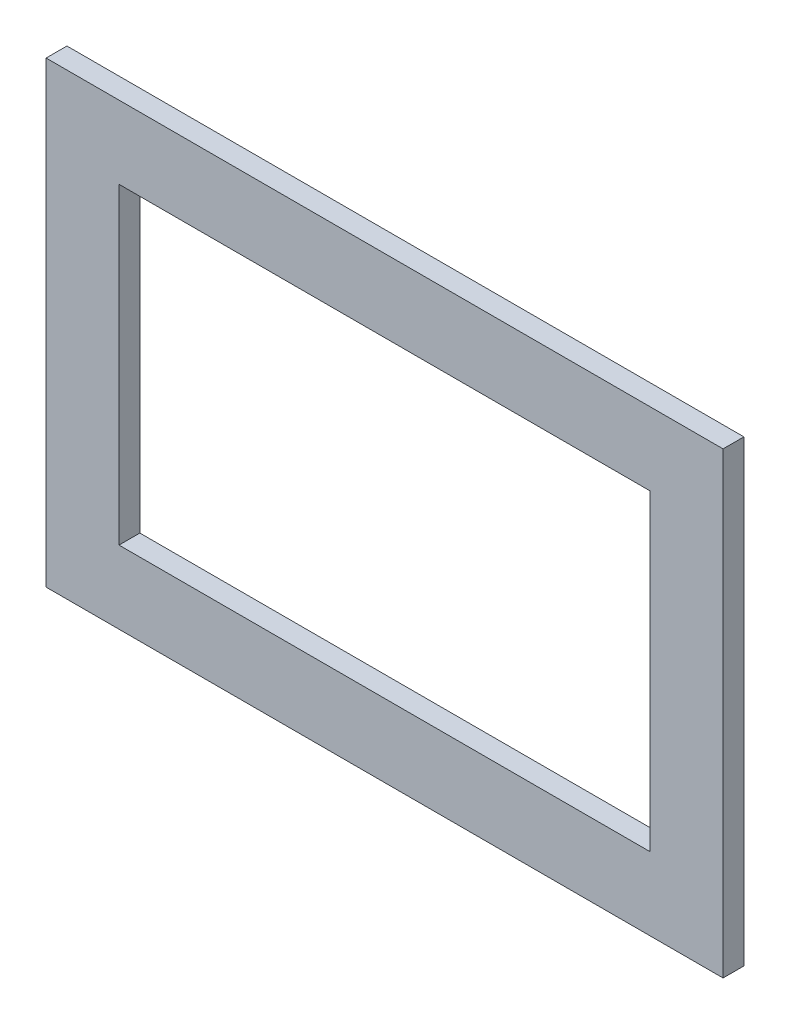
ISO-10303-21;
HEADER;
FILE_DESCRIPTION(('STEP AP214'),'2;1');
FILE_NAME('part.step','',(''),(''),'','','');
FILE_SCHEMA(('AUTOMOTIVE_DESIGN { 1 0 10303 214 1 1 1 1 }'));
ENDSEC;
DATA;
#1=APPLICATION_CONTEXT('core data for automotive mechanical design processes');
#2=APPLICATION_PROTOCOL_DEFINITION('international standard','automotive_design',2000,#1);
#3=PRODUCT_CONTEXT('',#1,'mechanical');
#4=PRODUCT('Part','Part','',(#3));
#5=PRODUCT_RELATED_PRODUCT_CATEGORY('part','',(#4));
#6=PRODUCT_DEFINITION_FORMATION('','',#4);
#7=PRODUCT_DEFINITION_CONTEXT('part definition',#1,'design');
#8=PRODUCT_DEFINITION('design','',#6,#7);
#9=PRODUCT_DEFINITION_SHAPE('','',#8);
#10=(LENGTH_UNIT() NAMED_UNIT(*) SI_UNIT(.MILLI.,.METRE.));
#11=(NAMED_UNIT(*) PLANE_ANGLE_UNIT() SI_UNIT($,.RADIAN.));
#12=(NAMED_UNIT(*) SI_UNIT($,.STERADIAN.) SOLID_ANGLE_UNIT());
#13=UNCERTAINTY_MEASURE_WITH_UNIT(LENGTH_MEASURE(1.E-05),#10,'distance_accuracy_value','');
#14=(GEOMETRIC_REPRESENTATION_CONTEXT(3) GLOBAL_UNCERTAINTY_ASSIGNED_CONTEXT((#13)) GLOBAL_UNIT_ASSIGNED_CONTEXT((#10,
#11,#12)) REPRESENTATION_CONTEXT('',''));
#15=CARTESIAN_POINT('',(0.,0.,0.));
#16=DIRECTION('',(0.,0.,1.));
#17=DIRECTION('',(1.,0.,0.));
#18=AXIS2_PLACEMENT_3D('',#15,#16,#17);
#19=CARTESIAN_POINT('',(0.,0.,20.));
#20=DIRECTION('',(0.,0.,1.));
#21=DIRECTION('',(1.,0.,0.));
#22=AXIS2_PLACEMENT_3D('',#19,#20,#21);
#23=PLANE('',#22);
#24=DIRECTION('',(0.,-1.,0.));
#25=VECTOR('',#24,1.);
#26=CARTESIAN_POINT('',(-266.698473282443,134.080195581127,20.));
#27=LINE('',#26,#25);
#28=CARTESIAN_POINT('',(-266.698473282443,134.080195581127,20.));
#29=VERTEX_POINT('',#28);
#30=CARTESIAN_POINT('',(-266.698473282443,-305.919804418873,20.));
#31=VERTEX_POINT('',#30);
#32=EDGE_CURVE('E153',#29,#31,#27,.T.);
#33=ORIENTED_EDGE('',*,*,#32,.T.);
#34=DIRECTION('',(1.,0.,0.));
#35=VECTOR('',#34,1.);
#36=CARTESIAN_POINT('',(-266.698473282443,-305.919804418873,20.));
#37=LINE('',#36,#35);
#38=CARTESIAN_POINT('',(383.301526717557,-305.919804418873,20.));
#39=VERTEX_POINT('',#38);
#40=EDGE_CURVE('E157',#31,#39,#37,.T.);
#41=ORIENTED_EDGE('',*,*,#40,.T.);
#42=DIRECTION('',(0.,1.,0.));
#43=VECTOR('',#42,1.);
#44=CARTESIAN_POINT('',(383.301526717557,134.080195581127,20.));
#45=LINE('',#44,#43);
#46=CARTESIAN_POINT('',(383.301526717557,134.080195581127,20.));
#47=VERTEX_POINT('',#46);
#48=EDGE_CURVE('E161',#39,#47,#45,.T.);
#49=ORIENTED_EDGE('',*,*,#48,.T.);
#50=DIRECTION('',(-1.,0.,0.));
#51=VECTOR('',#50,1.);
#52=CARTESIAN_POINT('',(-266.698473282443,134.080195581127,20.));
#53=LINE('',#52,#51);
#54=EDGE_CURVE('E164',#47,#29,#53,.T.);
#55=ORIENTED_EDGE('',*,*,#54,.T.);
#56=EDGE_LOOP('',(#33,#41,#49,#55));
#57=FACE_BOUND('',#56,.T.);
#58=DIRECTION('',(1.,0.,0.));
#59=VECTOR('',#58,1.);
#60=CARTESIAN_POINT('',(-196.698473282443,-235.919804418873,20.));
#61=LINE('',#60,#59);
#62=CARTESIAN_POINT('',(-196.698473282443,-235.919804418873,20.));
#63=VERTEX_POINT('',#62);
#64=CARTESIAN_POINT('',(313.301526717557,-235.919804418873,20.));
#65=VERTEX_POINT('',#64);
#66=EDGE_CURVE('E114',#63,#65,#61,.T.);
#67=ORIENTED_EDGE('',*,*,#66,.F.);
#68=DIRECTION('',(0.,-1.,0.));
#69=VECTOR('',#68,1.);
#70=CARTESIAN_POINT('',(-196.698473282443,64.0801955811267,20.));
#71=LINE('',#70,#69);
#72=CARTESIAN_POINT('',(-196.698473282443,64.0801955811267,20.));
#73=VERTEX_POINT('',#72);
#74=EDGE_CURVE('E105',#73,#63,#71,.T.);
#75=ORIENTED_EDGE('',*,*,#74,.F.);
#76=DIRECTION('',(-1.,0.,0.));
#77=VECTOR('',#76,1.);
#78=CARTESIAN_POINT('',(-196.698473282443,64.0801955811267,20.));
#79=LINE('',#78,#77);
#80=CARTESIAN_POINT('',(313.301526717557,64.0801955811267,20.));
#81=VERTEX_POINT('',#80);
#82=EDGE_CURVE('E131',#81,#73,#79,.T.);
#83=ORIENTED_EDGE('',*,*,#82,.F.);
#84=DIRECTION('',(0.,1.,0.));
#85=VECTOR('',#84,1.);
#86=CARTESIAN_POINT('',(313.301526717557,64.0801955811267,20.));
#87=LINE('',#86,#85);
#88=EDGE_CURVE('E127',#65,#81,#87,.T.);
#89=ORIENTED_EDGE('',*,*,#88,.F.);
#90=EDGE_LOOP('',(#67,#75,#83,#89));
#91=FACE_BOUND('',#90,.T.);
#92=ADVANCED_FACE('F39',(#57,#91),#23,.T.);
#93=CARTESIAN_POINT('',(0.,0.,0.));
#94=DIRECTION('',(0.,0.,1.));
#95=DIRECTION('',(1.,0.,0.));
#96=AXIS2_PLACEMENT_3D('',#93,#94,#95);
#97=PLANE('',#96);
#98=DIRECTION('',(0.,-1.,0.));
#99=VECTOR('',#98,1.);
#100=CARTESIAN_POINT('',(-266.698473282443,134.080195581127,0.));
#101=LINE('',#100,#99);
#102=CARTESIAN_POINT('',(-266.698473282443,134.080195581127,0.));
#103=VERTEX_POINT('',#102);
#104=CARTESIAN_POINT('',(-266.698473282443,-305.919804418873,0.));
#105=VERTEX_POINT('',#104);
#106=EDGE_CURVE('E123',#103,#105,#101,.T.);
#107=ORIENTED_EDGE('',*,*,#106,.F.);
#108=DIRECTION('',(-1.,0.,0.));
#109=VECTOR('',#108,1.);
#110=CARTESIAN_POINT('',(-266.698473282443,134.080195581127,0.));
#111=LINE('',#110,#109);
#112=CARTESIAN_POINT('',(383.301526717557,134.080195581127,0.));
#113=VERTEX_POINT('',#112);
#114=EDGE_CURVE('E158',#113,#103,#111,.T.);
#115=ORIENTED_EDGE('',*,*,#114,.F.);
#116=DIRECTION('',(0.,1.,0.));
#117=VECTOR('',#116,1.);
#118=CARTESIAN_POINT('',(383.301526717557,134.080195581127,0.));
#119=LINE('',#118,#117);
#120=CARTESIAN_POINT('',(383.301526717557,-305.919804418873,0.));
#121=VERTEX_POINT('',#120);
#122=EDGE_CURVE('E174',#121,#113,#119,.T.);
#123=ORIENTED_EDGE('',*,*,#122,.F.);
#124=DIRECTION('',(1.,0.,0.));
#125=VECTOR('',#124,1.);
#126=CARTESIAN_POINT('',(-266.698473282443,-305.919804418873,0.));
#127=LINE('',#126,#125);
#128=EDGE_CURVE('E171',#105,#121,#127,.T.);
#129=ORIENTED_EDGE('',*,*,#128,.F.);
#130=EDGE_LOOP('',(#107,#115,#123,#129));
#131=FACE_BOUND('',#130,.T.);
#132=DIRECTION('',(0.,-1.,0.));
#133=VECTOR('',#132,1.);
#134=CARTESIAN_POINT('',(-196.698473282443,64.0801955811267,0.));
#135=LINE('',#134,#133);
#136=CARTESIAN_POINT('',(-196.698473282443,64.0801955811267,0.));
#137=VERTEX_POINT('',#136);
#138=CARTESIAN_POINT('',(-196.698473282443,-235.919804418873,0.));
#139=VERTEX_POINT('',#138);
#140=EDGE_CURVE('E63',#137,#139,#135,.T.);
#141=ORIENTED_EDGE('',*,*,#140,.T.);
#142=DIRECTION('',(1.,0.,0.));
#143=VECTOR('',#142,1.);
#144=CARTESIAN_POINT('',(-196.698473282443,-235.919804418873,0.));
#145=LINE('',#144,#143);
#146=CARTESIAN_POINT('',(313.301526717557,-235.919804418873,0.));
#147=VERTEX_POINT('',#146);
#148=EDGE_CURVE('E121',#139,#147,#145,.T.);
#149=ORIENTED_EDGE('',*,*,#148,.T.);
#150=DIRECTION('',(0.,1.,0.));
#151=VECTOR('',#150,1.);
#152=CARTESIAN_POINT('',(313.301526717557,64.0801955811267,0.));
#153=LINE('',#152,#151);
#154=CARTESIAN_POINT('',(313.301526717557,64.0801955811267,0.));
#155=VERTEX_POINT('',#154);
#156=EDGE_CURVE('E140',#147,#155,#153,.T.);
#157=ORIENTED_EDGE('',*,*,#156,.T.);
#158=DIRECTION('',(-1.,0.,0.));
#159=VECTOR('',#158,1.);
#160=CARTESIAN_POINT('',(-196.698473282443,64.0801955811267,0.));
#161=LINE('',#160,#159);
#162=EDGE_CURVE('E115',#155,#137,#161,.T.);
#163=ORIENTED_EDGE('',*,*,#162,.T.);
#164=EDGE_LOOP('',(#141,#149,#157,#163));
#165=FACE_BOUND('',#164,.T.);
#166=ADVANCED_FACE('F197',(#131,#165),#97,.F.);
#167=CARTESIAN_POINT('',(-266.698473282443,134.080195581127,20.));
#168=DIRECTION('',(1.,0.,0.));
#169=DIRECTION('',(0.,0.,-1.));
#170=AXIS2_PLACEMENT_3D('',#167,#168,#169);
#171=PLANE('',#170);
#172=ORIENTED_EDGE('',*,*,#106,.T.);
#173=DIRECTION('',(0.,0.,-1.));
#174=VECTOR('',#173,1.);
#175=CARTESIAN_POINT('',(-266.698473282443,-305.919804418873,20.));
#176=LINE('',#175,#174);
#177=EDGE_CURVE('E11',#31,#105,#176,.T.);
#178=ORIENTED_EDGE('',*,*,#177,.F.);
#179=ORIENTED_EDGE('',*,*,#32,.F.);
#180=DIRECTION('',(0.,0.,-1.));
#181=VECTOR('',#180,1.);
#182=CARTESIAN_POINT('',(-266.698473282443,134.080195581127,20.));
#183=LINE('',#182,#181);
#184=EDGE_CURVE('E167',#29,#103,#183,.T.);
#185=ORIENTED_EDGE('',*,*,#184,.T.);
#186=EDGE_LOOP('',(#172,#178,#179,#185));
#187=FACE_BOUND('',#186,.T.);
#188=ADVANCED_FACE('F41',(#187),#171,.F.);
#189=CARTESIAN_POINT('',(-266.698473282443,-305.919804418873,20.));
#190=DIRECTION('',(0.,1.,0.));
#191=DIRECTION('',(0.,0.,1.));
#192=AXIS2_PLACEMENT_3D('',#189,#190,#191);
#193=PLANE('',#192);
#194=ORIENTED_EDGE('',*,*,#128,.T.);
#195=DIRECTION('',(0.,0.,-1.));
#196=VECTOR('',#195,1.);
#197=CARTESIAN_POINT('',(383.301526717557,-305.919804418873,20.));
#198=LINE('',#197,#196);
#199=EDGE_CURVE('E48',#39,#121,#198,.T.);
#200=ORIENTED_EDGE('',*,*,#199,.F.);
#201=ORIENTED_EDGE('',*,*,#40,.F.);
#202=ORIENTED_EDGE('',*,*,#177,.T.);
#203=EDGE_LOOP('',(#194,#200,#201,#202));
#204=FACE_BOUND('',#203,.T.);
#205=ADVANCED_FACE('F207',(#204),#193,.F.);
#206=CARTESIAN_POINT('',(383.301526717557,134.080195581127,20.));
#207=DIRECTION('',(-1.,0.,0.));
#208=DIRECTION('',(0.,-1.,0.));
#209=AXIS2_PLACEMENT_3D('',#206,#207,#208);
#210=PLANE('',#209);
#211=ORIENTED_EDGE('',*,*,#122,.T.);
#212=DIRECTION('',(0.,0.,-1.));
#213=VECTOR('',#212,1.);
#214=CARTESIAN_POINT('',(383.301526717557,134.080195581127,20.));
#215=LINE('',#214,#213);
#216=EDGE_CURVE('E182',#47,#113,#215,.T.);
#217=ORIENTED_EDGE('',*,*,#216,.F.);
#218=ORIENTED_EDGE('',*,*,#48,.F.);
#219=ORIENTED_EDGE('',*,*,#199,.T.);
#220=EDGE_LOOP('',(#211,#217,#218,#219));
#221=FACE_BOUND('',#220,.T.);
#222=ADVANCED_FACE('F191',(#221),#210,.F.);
#223=CARTESIAN_POINT('',(-266.698473282443,134.080195581127,20.));
#224=DIRECTION('',(0.,-1.,0.));
#225=DIRECTION('',(0.,0.,-1.));
#226=AXIS2_PLACEMENT_3D('',#223,#224,#225);
#227=PLANE('',#226);
#228=ORIENTED_EDGE('',*,*,#114,.T.);
#229=ORIENTED_EDGE('',*,*,#184,.F.);
#230=ORIENTED_EDGE('',*,*,#54,.F.);
#231=ORIENTED_EDGE('',*,*,#216,.T.);
#232=EDGE_LOOP('',(#228,#229,#230,#231));
#233=FACE_BOUND('',#232,.T.);
#234=ADVANCED_FACE('F201',(#233),#227,.F.);
#235=CARTESIAN_POINT('',(-196.698473282443,64.0801955811267,20.));
#236=DIRECTION('',(1.,0.,0.));
#237=DIRECTION('',(0.,1.,0.));
#238=AXIS2_PLACEMENT_3D('',#235,#236,#237);
#239=PLANE('',#238);
#240=ORIENTED_EDGE('',*,*,#140,.F.);
#241=DIRECTION('',(0.,0.,-1.));
#242=VECTOR('',#241,1.);
#243=CARTESIAN_POINT('',(-196.698473282443,64.0801955811267,20.));
#244=LINE('',#243,#242);
#245=EDGE_CURVE('E109',#73,#137,#244,.T.);
#246=ORIENTED_EDGE('',*,*,#245,.F.);
#247=ORIENTED_EDGE('',*,*,#74,.T.);
#248=DIRECTION('',(0.,0.,-1.));
#249=VECTOR('',#248,1.);
#250=CARTESIAN_POINT('',(-196.698473282443,-235.919804418873,20.));
#251=LINE('',#250,#249);
#252=EDGE_CURVE('E108',#63,#139,#251,.T.);
#253=ORIENTED_EDGE('',*,*,#252,.T.);
#254=EDGE_LOOP('',(#240,#246,#247,#253));
#255=FACE_BOUND('',#254,.T.);
#256=ADVANCED_FACE('F107',(#255),#239,.T.);
#257=CARTESIAN_POINT('',(-196.698473282443,-235.919804418873,20.));
#258=DIRECTION('',(0.,1.,0.));
#259=DIRECTION('',(0.,0.,1.));
#260=AXIS2_PLACEMENT_3D('',#257,#258,#259);
#261=PLANE('',#260);
#262=ORIENTED_EDGE('',*,*,#148,.F.);
#263=ORIENTED_EDGE('',*,*,#252,.F.);
#264=ORIENTED_EDGE('',*,*,#66,.T.);
#265=DIRECTION('',(0.,0.,-1.));
#266=VECTOR('',#265,1.);
#267=CARTESIAN_POINT('',(313.301526717557,-235.919804418873,20.));
#268=LINE('',#267,#266);
#269=EDGE_CURVE('E124',#65,#147,#268,.T.);
#270=ORIENTED_EDGE('',*,*,#269,.T.);
#271=EDGE_LOOP('',(#262,#263,#264,#270));
#272=FACE_BOUND('',#271,.T.);
#273=ADVANCED_FACE('F118',(#272),#261,.T.);
#274=CARTESIAN_POINT('',(313.301526717557,64.0801955811267,20.));
#275=DIRECTION('',(-1.,0.,0.));
#276=DIRECTION('',(0.,-1.,0.));
#277=AXIS2_PLACEMENT_3D('',#274,#275,#276);
#278=PLANE('',#277);
#279=ORIENTED_EDGE('',*,*,#156,.F.);
#280=ORIENTED_EDGE('',*,*,#269,.F.);
#281=ORIENTED_EDGE('',*,*,#88,.T.);
#282=DIRECTION('',(0.,0.,-1.));
#283=VECTOR('',#282,1.);
#284=CARTESIAN_POINT('',(313.301526717557,64.0801955811267,20.));
#285=LINE('',#284,#283);
#286=EDGE_CURVE('E55',#81,#155,#285,.T.);
#287=ORIENTED_EDGE('',*,*,#286,.T.);
#288=EDGE_LOOP('',(#279,#280,#281,#287));
#289=FACE_BOUND('',#288,.T.);
#290=ADVANCED_FACE('F230',(#289),#278,.T.);
#291=CARTESIAN_POINT('',(-196.698473282443,64.0801955811267,20.));
#292=DIRECTION('',(0.,-1.,0.));
#293=DIRECTION('',(1.,0.,0.));
#294=AXIS2_PLACEMENT_3D('',#291,#292,#293);
#295=PLANE('',#294);
#296=ORIENTED_EDGE('',*,*,#162,.F.);
#297=ORIENTED_EDGE('',*,*,#286,.F.);
#298=ORIENTED_EDGE('',*,*,#82,.T.);
#299=ORIENTED_EDGE('',*,*,#245,.T.);
#300=EDGE_LOOP('',(#296,#297,#298,#299));
#301=FACE_BOUND('',#300,.T.);
#302=ADVANCED_FACE('F234',(#301),#295,.T.);
#303=CLOSED_SHELL('',(#92,#166,#188,#205,#222,#234,#256,#273,#290,#302));
#304=MANIFOLD_SOLID_BREP('B2',#303);
#305=ADVANCED_BREP_SHAPE_REPRESENTATION('',(#18,#304),#14);
#306=SHAPE_DEFINITION_REPRESENTATION(#9,#305);
ENDSEC;
END-ISO-10303-21;
